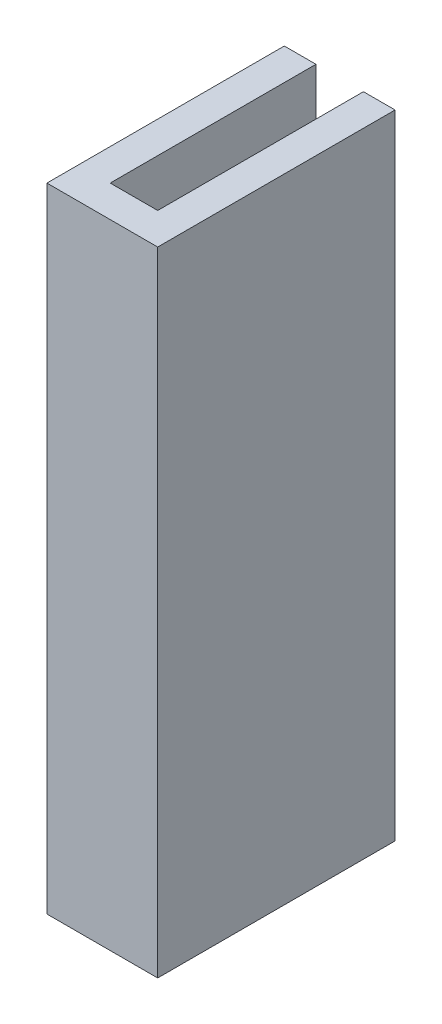
ISO-10303-21;
HEADER;
FILE_DESCRIPTION(('STEP AP214'),'2;1');
FILE_NAME('part.step','',(''),(''),'','','');
FILE_SCHEMA(('AUTOMOTIVE_DESIGN { 1 0 10303 214 1 1 1 1 }'));
ENDSEC;
DATA;
#1=APPLICATION_CONTEXT('core data for automotive mechanical design processes');
#2=APPLICATION_PROTOCOL_DEFINITION('international standard','automotive_design',2000,#1);
#3=PRODUCT_CONTEXT('',#1,'mechanical');
#4=PRODUCT('Part','Part','',(#3));
#5=PRODUCT_RELATED_PRODUCT_CATEGORY('part','',(#4));
#6=PRODUCT_DEFINITION_FORMATION('','',#4);
#7=PRODUCT_DEFINITION_CONTEXT('part definition',#1,'design');
#8=PRODUCT_DEFINITION('design','',#6,#7);
#9=PRODUCT_DEFINITION_SHAPE('','',#8);
#10=(LENGTH_UNIT() NAMED_UNIT(*) SI_UNIT(.MILLI.,.METRE.));
#11=(NAMED_UNIT(*) PLANE_ANGLE_UNIT() SI_UNIT($,.RADIAN.));
#12=(NAMED_UNIT(*) SI_UNIT($,.STERADIAN.) SOLID_ANGLE_UNIT());
#13=UNCERTAINTY_MEASURE_WITH_UNIT(LENGTH_MEASURE(1.E-05),#10,'distance_accuracy_value','');
#14=(GEOMETRIC_REPRESENTATION_CONTEXT(3) GLOBAL_UNCERTAINTY_ASSIGNED_CONTEXT((#13)) GLOBAL_UNIT_ASSIGNED_CONTEXT((#10,
#11,#12)) REPRESENTATION_CONTEXT('',''));
#15=CARTESIAN_POINT('',(0.,0.,0.));
#16=DIRECTION('',(0.,0.,1.));
#17=DIRECTION('',(1.,0.,0.));
#18=AXIS2_PLACEMENT_3D('',#15,#16,#17);
#19=CARTESIAN_POINT('',(1.5,40.,-15.));
#20=DIRECTION('',(1.,0.,0.));
#21=DIRECTION('',(0.,0.,-1.));
#22=AXIS2_PLACEMENT_3D('',#19,#20,#21);
#23=PLANE('',#22);
#24=DIRECTION('',(0.,-1.,0.));
#25=VECTOR('',#24,1.);
#26=CARTESIAN_POINT('',(1.5,40.,-2.));
#27=LINE('',#26,#25);
#28=CARTESIAN_POINT('',(1.5,8.5,-2.));
#29=VERTEX_POINT('',#28);
#30=CARTESIAN_POINT('',(1.5,0.,-2.));
#31=VERTEX_POINT('',#30);
#32=EDGE_CURVE('E227',#29,#31,#27,.T.);
#33=ORIENTED_EDGE('',*,*,#32,.F.);
#34=DIRECTION('',(0.,0.,-1.));
#35=VECTOR('',#34,1.);
#36=CARTESIAN_POINT('',(1.5,8.5,-15.));
#37=LINE('',#36,#35);
#38=CARTESIAN_POINT('',(1.5,8.5,-15.));
#39=VERTEX_POINT('',#38);
#40=EDGE_CURVE('E180',#29,#39,#37,.T.);
#41=ORIENTED_EDGE('',*,*,#40,.T.);
#42=DIRECTION('',(0.,-1.,0.));
#43=VECTOR('',#42,1.);
#44=CARTESIAN_POINT('',(1.5,40.,-15.));
#45=LINE('',#44,#43);
#46=CARTESIAN_POINT('',(1.5,0.,-15.));
#47=VERTEX_POINT('',#46);
#48=EDGE_CURVE('E230',#39,#47,#45,.T.);
#49=ORIENTED_EDGE('',*,*,#48,.T.);
#50=DIRECTION('',(0.,0.,1.));
#51=VECTOR('',#50,1.);
#52=CARTESIAN_POINT('',(1.5,0.,-15.));
#53=LINE('',#52,#51);
#54=EDGE_CURVE('E214',#47,#31,#53,.T.);
#55=ORIENTED_EDGE('',*,*,#54,.T.);
#56=EDGE_LOOP('',(#33,#41,#49,#55));
#57=FACE_BOUND('',#56,.T.);
#58=ADVANCED_FACE('F33',(#57),#23,.F.);
#59=CARTESIAN_POINT('',(-1.5,40.,-2.));
#60=DIRECTION('',(-1.,0.,0.));
#61=DIRECTION('',(0.,0.,1.));
#62=AXIS2_PLACEMENT_3D('',#59,#60,#61);
#63=PLANE('',#62);
#64=DIRECTION('',(0.,-1.,0.));
#65=VECTOR('',#64,1.);
#66=CARTESIAN_POINT('',(-1.5,40.,-15.));
#67=LINE('',#66,#65);
#68=CARTESIAN_POINT('',(-1.5,8.5,-15.));
#69=VERTEX_POINT('',#68);
#70=CARTESIAN_POINT('',(-1.5,0.,-15.));
#71=VERTEX_POINT('',#70);
#72=EDGE_CURVE('E202',#69,#71,#67,.T.);
#73=ORIENTED_EDGE('',*,*,#72,.F.);
#74=DIRECTION('',(0.,0.,1.));
#75=VECTOR('',#74,1.);
#76=CARTESIAN_POINT('',(-1.5,8.5,-2.));
#77=LINE('',#76,#75);
#78=CARTESIAN_POINT('',(-1.5,8.5,-2.));
#79=VERTEX_POINT('',#78);
#80=EDGE_CURVE('E11',#69,#79,#77,.T.);
#81=ORIENTED_EDGE('',*,*,#80,.T.);
#82=DIRECTION('',(0.,-1.,0.));
#83=VECTOR('',#82,1.);
#84=CARTESIAN_POINT('',(-1.5,40.,-2.));
#85=LINE('',#84,#83);
#86=CARTESIAN_POINT('',(-1.5,0.,-2.));
#87=VERTEX_POINT('',#86);
#88=EDGE_CURVE('E153',#79,#87,#85,.T.);
#89=ORIENTED_EDGE('',*,*,#88,.T.);
#90=DIRECTION('',(0.,0.,-1.));
#91=VECTOR('',#90,1.);
#92=CARTESIAN_POINT('',(-1.5,0.,-2.));
#93=LINE('',#92,#91);
#94=EDGE_CURVE('E188',#87,#71,#93,.T.);
#95=ORIENTED_EDGE('',*,*,#94,.T.);
#96=EDGE_LOOP('',(#73,#81,#89,#95));
#97=FACE_BOUND('',#96,.T.);
#98=ADVANCED_FACE('F310',(#97),#63,.F.);
#99=CARTESIAN_POINT('',(-1.5,40.,-15.));
#100=DIRECTION('',(0.,0.,1.));
#101=DIRECTION('',(1.,0.,0.));
#102=AXIS2_PLACEMENT_3D('',#99,#100,#101);
#103=PLANE('',#102);
#104=DIRECTION('',(0.,1.,0.));
#105=VECTOR('',#104,1.);
#106=CARTESIAN_POINT('',(-2.50000000000003,31.5,-15.));
#107=LINE('',#106,#105);
#108=CARTESIAN_POINT('',(-2.50000000000003,8.5,-15.));
#109=VERTEX_POINT('',#108);
#110=CARTESIAN_POINT('',(-2.50000000000003,31.5,-15.));
#111=VERTEX_POINT('',#110);
#112=EDGE_CURVE('E271',#109,#111,#107,.T.);
#113=ORIENTED_EDGE('',*,*,#112,.F.);
#114=DIRECTION('',(-1.,0.,0.));
#115=VECTOR('',#114,1.);
#116=CARTESIAN_POINT('',(2.5,8.5,-15.));
#117=LINE('',#116,#115);
#118=EDGE_CURVE('E169',#69,#109,#117,.T.);
#119=ORIENTED_EDGE('',*,*,#118,.F.);
#120=ORIENTED_EDGE('',*,*,#72,.T.);
#121=DIRECTION('',(-1.,0.,0.));
#122=VECTOR('',#121,1.);
#123=CARTESIAN_POINT('',(-1.5,0.,-15.));
#124=LINE('',#123,#122);
#125=CARTESIAN_POINT('',(-3.5,0.,-15.));
#126=VERTEX_POINT('',#125);
#127=EDGE_CURVE('E183',#71,#126,#124,.T.);
#128=ORIENTED_EDGE('',*,*,#127,.T.);
#129=DIRECTION('',(0.,-1.,0.));
#130=VECTOR('',#129,1.);
#131=CARTESIAN_POINT('',(-3.5,40.,-15.));
#132=LINE('',#131,#130);
#133=CARTESIAN_POINT('',(-3.5,40.,-15.));
#134=VERTEX_POINT('',#133);
#135=EDGE_CURVE('E243',#134,#126,#132,.T.);
#136=ORIENTED_EDGE('',*,*,#135,.F.);
#137=DIRECTION('',(-1.,0.,0.));
#138=VECTOR('',#137,1.);
#139=CARTESIAN_POINT('',(-1.5,40.,-15.));
#140=LINE('',#139,#138);
#141=CARTESIAN_POINT('',(-1.5,40.,-15.));
#142=VERTEX_POINT('',#141);
#143=EDGE_CURVE('E184',#142,#134,#140,.T.);
#144=ORIENTED_EDGE('',*,*,#143,.F.);
#145=CARTESIAN_POINT('',(-1.5,31.5,-15.));
#146=VERTEX_POINT('',#145);
#147=EDGE_CURVE('E221',#142,#146,#67,.T.);
#148=ORIENTED_EDGE('',*,*,#147,.T.);
#149=DIRECTION('',(1.,0.,0.));
#150=VECTOR('',#149,1.);
#151=CARTESIAN_POINT('',(2.5,31.5,-15.));
#152=LINE('',#151,#150);
#153=EDGE_CURVE('E56',#111,#146,#152,.T.);
#154=ORIENTED_EDGE('',*,*,#153,.F.);
#155=EDGE_LOOP('',(#113,#119,#120,#128,#136,#144,#148,#154));
#156=FACE_BOUND('',#155,.T.);
#157=ADVANCED_FACE('F35',(#156),#103,.F.);
#158=CARTESIAN_POINT('',(-3.5,40.,-15.));
#159=DIRECTION('',(1.,0.,0.));
#160=DIRECTION('',(0.,0.,-1.));
#161=AXIS2_PLACEMENT_3D('',#158,#159,#160);
#162=PLANE('',#161);
#163=DIRECTION('',(0.,0.,1.));
#164=VECTOR('',#163,1.);
#165=CARTESIAN_POINT('',(-3.5,0.,-15.));
#166=LINE('',#165,#164);
#167=CARTESIAN_POINT('',(-3.5,0.,0.));
#168=VERTEX_POINT('',#167);
#169=EDGE_CURVE('E205',#126,#168,#166,.T.);
#170=ORIENTED_EDGE('',*,*,#169,.T.);
#171=DIRECTION('',(0.,-1.,0.));
#172=VECTOR('',#171,1.);
#173=CARTESIAN_POINT('',(-3.5,40.,0.));
#174=LINE('',#173,#172);
#175=CARTESIAN_POINT('',(-3.5,40.,0.));
#176=VERTEX_POINT('',#175);
#177=EDGE_CURVE('E240',#176,#168,#174,.T.);
#178=ORIENTED_EDGE('',*,*,#177,.F.);
#179=DIRECTION('',(0.,0.,1.));
#180=VECTOR('',#179,1.);
#181=CARTESIAN_POINT('',(-3.5,40.,-15.));
#182=LINE('',#181,#180);
#183=EDGE_CURVE('E187',#134,#176,#182,.T.);
#184=ORIENTED_EDGE('',*,*,#183,.F.);
#185=ORIENTED_EDGE('',*,*,#135,.T.);
#186=EDGE_LOOP('',(#170,#178,#184,#185));
#187=FACE_BOUND('',#186,.T.);
#188=ADVANCED_FACE('F317',(#187),#162,.F.);
#189=CARTESIAN_POINT('',(-3.5,40.,0.));
#190=DIRECTION('',(0.,0.,-1.));
#191=DIRECTION('',(-1.,0.,0.));
#192=AXIS2_PLACEMENT_3D('',#189,#190,#191);
#193=PLANE('',#192);
#194=DIRECTION('',(1.,0.,0.));
#195=VECTOR('',#194,1.);
#196=CARTESIAN_POINT('',(-3.5,0.,0.));
#197=LINE('',#196,#195);
#198=CARTESIAN_POINT('',(3.5,0.,0.));
#199=VERTEX_POINT('',#198);
#200=EDGE_CURVE('E207',#168,#199,#197,.T.);
#201=ORIENTED_EDGE('',*,*,#200,.T.);
#202=DIRECTION('',(0.,-1.,0.));
#203=VECTOR('',#202,1.);
#204=CARTESIAN_POINT('',(3.5,40.,0.));
#205=LINE('',#204,#203);
#206=CARTESIAN_POINT('',(3.5,40.,0.));
#207=VERTEX_POINT('',#206);
#208=EDGE_CURVE('E237',#207,#199,#205,.T.);
#209=ORIENTED_EDGE('',*,*,#208,.F.);
#210=DIRECTION('',(1.,0.,0.));
#211=VECTOR('',#210,1.);
#212=CARTESIAN_POINT('',(-3.5,40.,0.));
#213=LINE('',#212,#211);
#214=EDGE_CURVE('E190',#176,#207,#213,.T.);
#215=ORIENTED_EDGE('',*,*,#214,.F.);
#216=ORIENTED_EDGE('',*,*,#177,.T.);
#217=EDGE_LOOP('',(#201,#209,#215,#216));
#218=FACE_BOUND('',#217,.T.);
#219=ADVANCED_FACE('F335',(#218),#193,.F.);
#220=CARTESIAN_POINT('',(3.5,40.,0.));
#221=DIRECTION('',(-1.,0.,0.));
#222=DIRECTION('',(0.,0.,1.));
#223=AXIS2_PLACEMENT_3D('',#220,#221,#222);
#224=PLANE('',#223);
#225=DIRECTION('',(0.,0.,-1.));
#226=VECTOR('',#225,1.);
#227=CARTESIAN_POINT('',(3.5,0.,0.));
#228=LINE('',#227,#226);
#229=CARTESIAN_POINT('',(3.5,0.,-15.));
#230=VERTEX_POINT('',#229);
#231=EDGE_CURVE('E209',#199,#230,#228,.T.);
#232=ORIENTED_EDGE('',*,*,#231,.T.);
#233=DIRECTION('',(0.,-1.,0.));
#234=VECTOR('',#233,1.);
#235=CARTESIAN_POINT('',(3.5,40.,-15.));
#236=LINE('',#235,#234);
#237=CARTESIAN_POINT('',(3.5,40.,-15.));
#238=VERTEX_POINT('',#237);
#239=EDGE_CURVE('E234',#238,#230,#236,.T.);
#240=ORIENTED_EDGE('',*,*,#239,.F.);
#241=DIRECTION('',(0.,0.,-1.));
#242=VECTOR('',#241,1.);
#243=CARTESIAN_POINT('',(3.5,40.,0.));
#244=LINE('',#243,#242);
#245=EDGE_CURVE('E192',#207,#238,#244,.T.);
#246=ORIENTED_EDGE('',*,*,#245,.F.);
#247=ORIENTED_EDGE('',*,*,#208,.T.);
#248=EDGE_LOOP('',(#232,#240,#246,#247));
#249=FACE_BOUND('',#248,.T.);
#250=ADVANCED_FACE('F302',(#249),#224,.F.);
#251=CARTESIAN_POINT('',(3.5,40.,-15.));
#252=DIRECTION('',(0.,0.,1.));
#253=DIRECTION('',(1.,0.,0.));
#254=AXIS2_PLACEMENT_3D('',#251,#252,#253);
#255=PLANE('',#254);
#256=ORIENTED_EDGE('',*,*,#48,.F.);
#257=CARTESIAN_POINT('',(2.5,8.5,-15.));
#258=VERTEX_POINT('',#257);
#259=EDGE_CURVE('E269',#258,#39,#117,.T.);
#260=ORIENTED_EDGE('',*,*,#259,.F.);
#261=DIRECTION('',(0.,-1.,0.));
#262=VECTOR('',#261,1.);
#263=CARTESIAN_POINT('',(2.5,31.5,-15.));
#264=LINE('',#263,#262);
#265=CARTESIAN_POINT('',(2.5,31.5,-15.));
#266=VERTEX_POINT('',#265);
#267=EDGE_CURVE('E266',#266,#258,#264,.T.);
#268=ORIENTED_EDGE('',*,*,#267,.F.);
#269=CARTESIAN_POINT('',(1.5,31.5,-15.));
#270=VERTEX_POINT('',#269);
#271=EDGE_CURVE('E273',#270,#266,#152,.T.);
#272=ORIENTED_EDGE('',*,*,#271,.F.);
#273=CARTESIAN_POINT('',(1.5,40.,-15.));
#274=VERTEX_POINT('',#273);
#275=EDGE_CURVE('E231',#274,#270,#45,.T.);
#276=ORIENTED_EDGE('',*,*,#275,.F.);
#277=DIRECTION('',(-1.,0.,0.));
#278=VECTOR('',#277,1.);
#279=CARTESIAN_POINT('',(3.5,40.,-15.));
#280=LINE('',#279,#278);
#281=EDGE_CURVE('E194',#238,#274,#280,.T.);
#282=ORIENTED_EDGE('',*,*,#281,.F.);
#283=ORIENTED_EDGE('',*,*,#239,.T.);
#284=DIRECTION('',(-1.,0.,0.));
#285=VECTOR('',#284,1.);
#286=CARTESIAN_POINT('',(3.5,0.,-15.));
#287=LINE('',#286,#285);
#288=EDGE_CURVE('E211',#230,#47,#287,.T.);
#289=ORIENTED_EDGE('',*,*,#288,.T.);
#290=EDGE_LOOP('',(#256,#260,#268,#272,#276,#282,#283,#289));
#291=FACE_BOUND('',#290,.T.);
#292=ADVANCED_FACE('F285',(#291),#255,.F.);
#293=ORIENTED_EDGE('',*,*,#275,.T.);
#294=DIRECTION('',(0.,0.,1.));
#295=VECTOR('',#294,1.);
#296=CARTESIAN_POINT('',(1.5,31.5,-15.));
#297=LINE('',#296,#295);
#298=CARTESIAN_POINT('',(1.5,31.5,-2.));
#299=VERTEX_POINT('',#298);
#300=EDGE_CURVE('E177',#270,#299,#297,.T.);
#301=ORIENTED_EDGE('',*,*,#300,.T.);
#302=CARTESIAN_POINT('',(1.5,40.,-2.));
#303=VERTEX_POINT('',#302);
#304=EDGE_CURVE('E228',#303,#299,#27,.T.);
#305=ORIENTED_EDGE('',*,*,#304,.F.);
#306=DIRECTION('',(0.,0.,1.));
#307=VECTOR('',#306,1.);
#308=CARTESIAN_POINT('',(1.5,40.,-15.));
#309=LINE('',#308,#307);
#310=EDGE_CURVE('E196',#274,#303,#309,.T.);
#311=ORIENTED_EDGE('',*,*,#310,.F.);
#312=EDGE_LOOP('',(#293,#301,#305,#311));
#313=FACE_BOUND('',#312,.T.);
#314=ADVANCED_FACE('F294',(#313),#23,.F.);
#315=CARTESIAN_POINT('',(1.5,40.,-2.));
#316=DIRECTION('',(0.,0.,1.));
#317=DIRECTION('',(1.,0.,0.));
#318=AXIS2_PLACEMENT_3D('',#315,#316,#317);
#319=PLANE('',#318);
#320=ORIENTED_EDGE('',*,*,#304,.T.);
#321=DIRECTION('',(1.,0.,0.));
#322=VECTOR('',#321,1.);
#323=CARTESIAN_POINT('',(2.50000000000003,31.5,-2.));
#324=LINE('',#323,#322);
#325=CARTESIAN_POINT('',(2.50000000000003,31.5,-2.));
#326=VERTEX_POINT('',#325);
#327=EDGE_CURVE('E48',#299,#326,#324,.T.);
#328=ORIENTED_EDGE('',*,*,#327,.T.);
#329=DIRECTION('',(0.,-1.,0.));
#330=VECTOR('',#329,1.);
#331=CARTESIAN_POINT('',(2.50000000000001,31.5,-2.));
#332=LINE('',#331,#330);
#333=CARTESIAN_POINT('',(2.50000000000003,8.5,-2.));
#334=VERTEX_POINT('',#333);
#335=EDGE_CURVE('E178',#326,#334,#332,.T.);
#336=ORIENTED_EDGE('',*,*,#335,.T.);
#337=DIRECTION('',(-1.,0.,0.));
#338=VECTOR('',#337,1.);
#339=CARTESIAN_POINT('',(2.50000000000003,8.5,-2.));
#340=LINE('',#339,#338);
#341=EDGE_CURVE('E156',#334,#29,#340,.T.);
#342=ORIENTED_EDGE('',*,*,#341,.T.);
#343=ORIENTED_EDGE('',*,*,#32,.T.);
#344=DIRECTION('',(-1.,0.,0.));
#345=VECTOR('',#344,1.);
#346=CARTESIAN_POINT('',(1.5,0.,-2.));
#347=LINE('',#346,#345);
#348=EDGE_CURVE('E217',#31,#87,#347,.T.);
#349=ORIENTED_EDGE('',*,*,#348,.T.);
#350=ORIENTED_EDGE('',*,*,#88,.F.);
#351=CARTESIAN_POINT('',(-2.50000000000001,8.5,-2.));
#352=VERTEX_POINT('',#351);
#353=EDGE_CURVE('E146',#79,#352,#340,.T.);
#354=ORIENTED_EDGE('',*,*,#353,.T.);
#355=DIRECTION('',(0.,1.,0.));
#356=VECTOR('',#355,1.);
#357=CARTESIAN_POINT('',(-2.50000000000001,31.5,-2.));
#358=LINE('',#357,#356);
#359=CARTESIAN_POINT('',(-2.50000000000001,31.5,-2.));
#360=VERTEX_POINT('',#359);
#361=EDGE_CURVE('E151',#352,#360,#358,.T.);
#362=ORIENTED_EDGE('',*,*,#361,.T.);
#363=CARTESIAN_POINT('',(-1.5,31.5,-2.));
#364=VERTEX_POINT('',#363);
#365=EDGE_CURVE('E259',#360,#364,#324,.T.);
#366=ORIENTED_EDGE('',*,*,#365,.T.);
#367=CARTESIAN_POINT('',(-1.5,40.,-2.));
#368=VERTEX_POINT('',#367);
#369=EDGE_CURVE('E224',#368,#364,#85,.T.);
#370=ORIENTED_EDGE('',*,*,#369,.F.);
#371=DIRECTION('',(-1.,0.,0.));
#372=VECTOR('',#371,1.);
#373=CARTESIAN_POINT('',(1.5,40.,-2.));
#374=LINE('',#373,#372);
#375=EDGE_CURVE('E198',#303,#368,#374,.T.);
#376=ORIENTED_EDGE('',*,*,#375,.F.);
#377=EDGE_LOOP('',(#320,#328,#336,#342,#343,#349,#350,#354,#362,#366,#370,#376));
#378=FACE_BOUND('',#377,.T.);
#379=ADVANCED_FACE('F149',(#378),#319,.F.);
#380=ORIENTED_EDGE('',*,*,#369,.T.);
#381=DIRECTION('',(0.,0.,-1.));
#382=VECTOR('',#381,1.);
#383=CARTESIAN_POINT('',(-1.5,31.5,-2.));
#384=LINE('',#383,#382);
#385=EDGE_CURVE('E41',#364,#146,#384,.T.);
#386=ORIENTED_EDGE('',*,*,#385,.T.);
#387=ORIENTED_EDGE('',*,*,#147,.F.);
#388=DIRECTION('',(0.,0.,-1.));
#389=VECTOR('',#388,1.);
#390=CARTESIAN_POINT('',(-1.5,40.,-2.));
#391=LINE('',#390,#389);
#392=EDGE_CURVE('E200',#368,#142,#391,.T.);
#393=ORIENTED_EDGE('',*,*,#392,.F.);
#394=EDGE_LOOP('',(#380,#386,#387,#393));
#395=FACE_BOUND('',#394,.T.);
#396=ADVANCED_FACE('F247',(#395),#63,.F.);
#397=CARTESIAN_POINT('',(0.,40.,0.));
#398=DIRECTION('',(0.,1.,0.));
#399=DIRECTION('',(0.,0.,1.));
#400=AXIS2_PLACEMENT_3D('',#397,#398,#399);
#401=PLANE('',#400);
#402=ORIENTED_EDGE('',*,*,#143,.T.);
#403=ORIENTED_EDGE('',*,*,#183,.T.);
#404=ORIENTED_EDGE('',*,*,#214,.T.);
#405=ORIENTED_EDGE('',*,*,#245,.T.);
#406=ORIENTED_EDGE('',*,*,#281,.T.);
#407=ORIENTED_EDGE('',*,*,#310,.T.);
#408=ORIENTED_EDGE('',*,*,#375,.T.);
#409=ORIENTED_EDGE('',*,*,#392,.T.);
#410=EDGE_LOOP('',(#402,#403,#404,#405,#406,#407,#408,#409));
#411=FACE_BOUND('',#410,.T.);
#412=ADVANCED_FACE('F254',(#411),#401,.T.);
#413=CARTESIAN_POINT('',(0.,0.,0.));
#414=DIRECTION('',(0.,1.,0.));
#415=DIRECTION('',(0.,0.,1.));
#416=AXIS2_PLACEMENT_3D('',#413,#414,#415);
#417=PLANE('',#416);
#418=ORIENTED_EDGE('',*,*,#127,.F.);
#419=ORIENTED_EDGE('',*,*,#94,.F.);
#420=ORIENTED_EDGE('',*,*,#348,.F.);
#421=ORIENTED_EDGE('',*,*,#54,.F.);
#422=ORIENTED_EDGE('',*,*,#288,.F.);
#423=ORIENTED_EDGE('',*,*,#231,.F.);
#424=ORIENTED_EDGE('',*,*,#200,.F.);
#425=ORIENTED_EDGE('',*,*,#169,.F.);
#426=EDGE_LOOP('',(#418,#419,#420,#421,#422,#423,#424,#425));
#427=FACE_BOUND('',#426,.T.);
#428=ADVANCED_FACE('F307',(#427),#417,.F.);
#429=CARTESIAN_POINT('',(2.50000000000003,31.5,21.5372045918796));
#430=DIRECTION('',(0.,1.,0.));
#431=DIRECTION('',(0.,0.,1.));
#432=AXIS2_PLACEMENT_3D('',#429,#430,#431);
#433=PLANE('',#432);
#434=ORIENTED_EDGE('',*,*,#365,.F.);
#435=DIRECTION('',(0.,0.,-1.));
#436=VECTOR('',#435,1.);
#437=CARTESIAN_POINT('',(-2.49999999999999,31.5,21.5372045918796));
#438=LINE('',#437,#436);
#439=EDGE_CURVE('E165',#360,#111,#438,.T.);
#440=ORIENTED_EDGE('',*,*,#439,.T.);
#441=ORIENTED_EDGE('',*,*,#153,.T.);
#442=ORIENTED_EDGE('',*,*,#385,.F.);
#443=EDGE_LOOP('',(#434,#440,#441,#442));
#444=FACE_BOUND('',#443,.T.);
#445=ADVANCED_FACE('F378',(#444),#433,.F.);
#446=CARTESIAN_POINT('',(2.50000000000003,8.5,21.5372045918796));
#447=DIRECTION('',(0.,-1.,0.));
#448=DIRECTION('',(0.,0.,-1.));
#449=AXIS2_PLACEMENT_3D('',#446,#447,#448);
#450=PLANE('',#449);
#451=ORIENTED_EDGE('',*,*,#118,.T.);
#452=DIRECTION('',(0.,0.,-1.));
#453=VECTOR('',#452,1.);
#454=CARTESIAN_POINT('',(-2.49999999999999,8.5,21.5372045918796));
#455=LINE('',#454,#453);
#456=EDGE_CURVE('E163',#352,#109,#455,.T.);
#457=ORIENTED_EDGE('',*,*,#456,.F.);
#458=ORIENTED_EDGE('',*,*,#353,.F.);
#459=ORIENTED_EDGE('',*,*,#80,.F.);
#460=EDGE_LOOP('',(#451,#457,#458,#459));
#461=FACE_BOUND('',#460,.T.);
#462=ADVANCED_FACE('F167',(#461),#450,.F.);
#463=CARTESIAN_POINT('',(-2.49999999999999,31.5,21.5372045918796));
#464=DIRECTION('',(-1.,0.,0.));
#465=DIRECTION('',(0.,0.,1.));
#466=AXIS2_PLACEMENT_3D('',#463,#464,#465);
#467=PLANE('',#466);
#468=ORIENTED_EDGE('',*,*,#456,.T.);
#469=ORIENTED_EDGE('',*,*,#112,.T.);
#470=ORIENTED_EDGE('',*,*,#439,.F.);
#471=ORIENTED_EDGE('',*,*,#361,.F.);
#472=EDGE_LOOP('',(#468,#469,#470,#471));
#473=FACE_BOUND('',#472,.T.);
#474=ADVANCED_FACE('F161',(#473),#467,.F.);
#475=ORIENTED_EDGE('',*,*,#341,.F.);
#476=DIRECTION('',(0.,0.,-1.));
#477=VECTOR('',#476,1.);
#478=CARTESIAN_POINT('',(2.50000000000003,8.5,21.5372045918796));
#479=LINE('',#478,#477);
#480=EDGE_CURVE('E175',#334,#258,#479,.T.);
#481=ORIENTED_EDGE('',*,*,#480,.T.);
#482=ORIENTED_EDGE('',*,*,#259,.T.);
#483=ORIENTED_EDGE('',*,*,#40,.F.);
#484=EDGE_LOOP('',(#475,#481,#482,#483));
#485=FACE_BOUND('',#484,.T.);
#486=ADVANCED_FACE('F287',(#485),#450,.F.);
#487=ORIENTED_EDGE('',*,*,#271,.T.);
#488=DIRECTION('',(0.,0.,-1.));
#489=VECTOR('',#488,1.);
#490=CARTESIAN_POINT('',(2.50000000000003,31.5,21.5372045918796));
#491=LINE('',#490,#489);
#492=EDGE_CURVE('E260',#326,#266,#491,.T.);
#493=ORIENTED_EDGE('',*,*,#492,.F.);
#494=ORIENTED_EDGE('',*,*,#327,.F.);
#495=ORIENTED_EDGE('',*,*,#300,.F.);
#496=EDGE_LOOP('',(#487,#493,#494,#495));
#497=FACE_BOUND('',#496,.T.);
#498=ADVANCED_FACE('F275',(#497),#433,.F.);
#499=CARTESIAN_POINT('',(2.50000000000003,31.5,21.5372045918796));
#500=DIRECTION('',(1.,0.,0.));
#501=DIRECTION('',(0.,0.,-1.));
#502=AXIS2_PLACEMENT_3D('',#499,#500,#501);
#503=PLANE('',#502);
#504=ORIENTED_EDGE('',*,*,#492,.T.);
#505=ORIENTED_EDGE('',*,*,#267,.T.);
#506=ORIENTED_EDGE('',*,*,#480,.F.);
#507=ORIENTED_EDGE('',*,*,#335,.F.);
#508=EDGE_LOOP('',(#504,#505,#506,#507));
#509=FACE_BOUND('',#508,.T.);
#510=ADVANCED_FACE('F281',(#509),#503,.F.);
#511=CLOSED_SHELL('',(#58,#98,#157,#188,#219,#250,#292,#314,#379,#396,#412,#428,#445,#462,#474,
#486,#498,#510));
#512=MANIFOLD_SOLID_BREP('B2',#511);
#513=ADVANCED_BREP_SHAPE_REPRESENTATION('',(#18,#512),#14);
#514=SHAPE_DEFINITION_REPRESENTATION(#9,#513);
ENDSEC;
END-ISO-10303-21;
